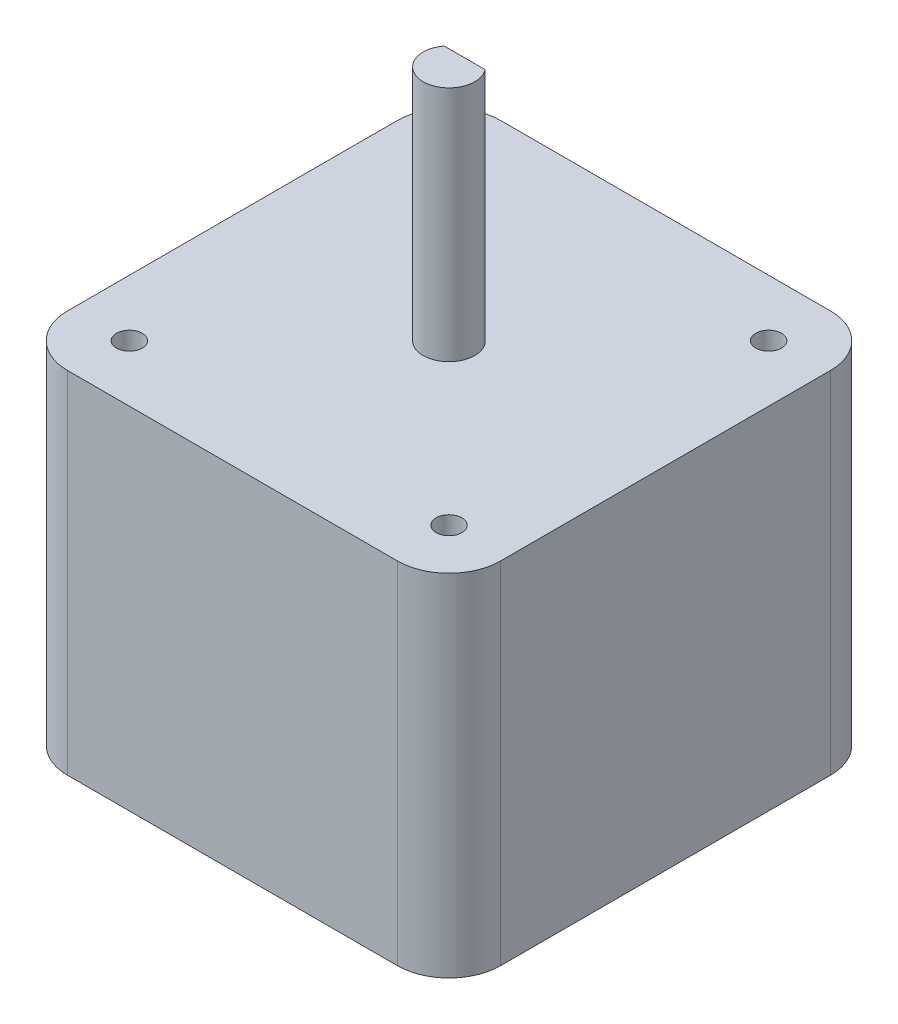
ISO-10303-21;
HEADER;
FILE_DESCRIPTION(('STEP AP214'),'2;1');
FILE_NAME('part.step','',(''),(''),'','','');
FILE_SCHEMA(('AUTOMOTIVE_DESIGN { 1 0 10303 214 1 1 1 1 }'));
ENDSEC;
DATA;
#1=APPLICATION_CONTEXT('core data for automotive mechanical design processes');
#2=APPLICATION_PROTOCOL_DEFINITION('international standard','automotive_design',2000,#1);
#3=PRODUCT_CONTEXT('',#1,'mechanical');
#4=PRODUCT('Part','Part','',(#3));
#5=PRODUCT_RELATED_PRODUCT_CATEGORY('part','',(#4));
#6=PRODUCT_DEFINITION_FORMATION('','',#4);
#7=PRODUCT_DEFINITION_CONTEXT('part definition',#1,'design');
#8=PRODUCT_DEFINITION('design','',#6,#7);
#9=PRODUCT_DEFINITION_SHAPE('','',#8);
#10=(LENGTH_UNIT() NAMED_UNIT(*) SI_UNIT(.MILLI.,.METRE.));
#11=(NAMED_UNIT(*) PLANE_ANGLE_UNIT() SI_UNIT($,.RADIAN.));
#12=(NAMED_UNIT(*) SI_UNIT($,.STERADIAN.) SOLID_ANGLE_UNIT());
#13=UNCERTAINTY_MEASURE_WITH_UNIT(LENGTH_MEASURE(1.E-05),#10,'distance_accuracy_value','');
#14=(GEOMETRIC_REPRESENTATION_CONTEXT(3) GLOBAL_UNCERTAINTY_ASSIGNED_CONTEXT((#13)) GLOBAL_UNIT_ASSIGNED_CONTEXT((#10,
#11,#12)) REPRESENTATION_CONTEXT('',''));
#15=CARTESIAN_POINT('',(0.,0.,0.));
#16=DIRECTION('',(0.,0.,1.));
#17=DIRECTION('',(1.,0.,0.));
#18=AXIS2_PLACEMENT_3D('',#15,#16,#17);
#19=CARTESIAN_POINT('',(0.,34.,0.));
#20=DIRECTION('',(0.,-1.,0.));
#21=DIRECTION('',(0.,0.,-1.));
#22=AXIS2_PLACEMENT_3D('',#19,#20,#21);
#23=PLANE('',#22);
#24=CARTESIAN_POINT('',(-15.5,34.,-15.5));
#25=DIRECTION('',(0.,1.,0.));
#26=DIRECTION('',(0.,0.,1.));
#27=AXIS2_PLACEMENT_3D('',#24,#25,#26);
#28=CIRCLE('',#27,1.25);
#29=CARTESIAN_POINT('',(-15.5,34.,-14.25));
#30=VERTEX_POINT('',#29);
#31=EDGE_CURVE('E140',#30,#30,#28,.T.);
#32=ORIENTED_EDGE('',*,*,#31,.F.);
#33=EDGE_LOOP('',(#32));
#34=FACE_BOUND('',#33,.T.);
#35=CARTESIAN_POINT('',(15.5,34.,15.5));
#36=DIRECTION('',(0.,1.,0.));
#37=DIRECTION('',(0.,0.,1.));
#38=AXIS2_PLACEMENT_3D('',#35,#36,#37);
#39=CIRCLE('',#38,1.25);
#40=CARTESIAN_POINT('',(15.5,34.,16.75));
#41=VERTEX_POINT('',#40);
#42=EDGE_CURVE('E160',#41,#41,#39,.T.);
#43=ORIENTED_EDGE('',*,*,#42,.F.);
#44=EDGE_LOOP('',(#43));
#45=FACE_BOUND('',#44,.T.);
#46=CARTESIAN_POINT('',(-15.5,34.,15.5));
#47=DIRECTION('',(0.,1.,0.));
#48=DIRECTION('',(0.,0.,1.));
#49=AXIS2_PLACEMENT_3D('',#46,#47,#48);
#50=CIRCLE('',#49,1.25);
#51=CARTESIAN_POINT('',(-15.5,34.,16.75));
#52=VERTEX_POINT('',#51);
#53=EDGE_CURVE('E166',#52,#52,#50,.T.);
#54=ORIENTED_EDGE('',*,*,#53,.F.);
#55=EDGE_LOOP('',(#54));
#56=FACE_BOUND('',#55,.T.);
#57=CARTESIAN_POINT('',(15.5,34.,-15.5));
#58=DIRECTION('',(0.,1.,0.));
#59=DIRECTION('',(0.,0.,1.));
#60=AXIS2_PLACEMENT_3D('',#57,#58,#59);
#61=CIRCLE('',#60,1.25);
#62=CARTESIAN_POINT('',(15.5,34.,-14.25));
#63=VERTEX_POINT('',#62);
#64=EDGE_CURVE('E172',#63,#63,#61,.T.);
#65=ORIENTED_EDGE('',*,*,#64,.F.);
#66=EDGE_LOOP('',(#65));
#67=FACE_BOUND('',#66,.T.);
#68=DIRECTION('',(-1.,0.,0.));
#69=VECTOR('',#68,1.);
#70=CARTESIAN_POINT('',(-21.,34.,-21.));
#71=LINE('',#70,#69);
#72=CARTESIAN_POINT('',(16.,34.,-21.));
#73=VERTEX_POINT('',#72);
#74=CARTESIAN_POINT('',(-16.,34.,-21.));
#75=VERTEX_POINT('',#74);
#76=EDGE_CURVE('E182',#73,#75,#71,.T.);
#77=ORIENTED_EDGE('',*,*,#76,.T.);
#78=CARTESIAN_POINT('',(-16.,34.,-16.));
#79=DIRECTION('',(0.,-1.,0.));
#80=DIRECTION('',(0.,0.,-1.));
#81=AXIS2_PLACEMENT_3D('',#78,#79,#80);
#82=CIRCLE('',#81,5.);
#83=CARTESIAN_POINT('',(-21.,34.,-16.));
#84=VERTEX_POINT('',#83);
#85=EDGE_CURVE('E222',#75,#84,#82,.F.);
#86=ORIENTED_EDGE('',*,*,#85,.T.);
#87=DIRECTION('',(0.,0.,1.));
#88=VECTOR('',#87,1.);
#89=CARTESIAN_POINT('',(-21.,34.,21.));
#90=LINE('',#89,#88);
#91=CARTESIAN_POINT('',(-21.,34.,16.));
#92=VERTEX_POINT('',#91);
#93=EDGE_CURVE('E186',#84,#92,#90,.T.);
#94=ORIENTED_EDGE('',*,*,#93,.T.);
#95=CARTESIAN_POINT('',(-16.,34.,16.));
#96=DIRECTION('',(0.,-1.,0.));
#97=DIRECTION('',(0.,0.,-1.));
#98=AXIS2_PLACEMENT_3D('',#95,#96,#97);
#99=CIRCLE('',#98,5.);
#100=CARTESIAN_POINT('',(-16.,34.,21.));
#101=VERTEX_POINT('',#100);
#102=EDGE_CURVE('E61',#92,#101,#99,.F.);
#103=ORIENTED_EDGE('',*,*,#102,.T.);
#104=DIRECTION('',(1.,0.,0.));
#105=VECTOR('',#104,1.);
#106=CARTESIAN_POINT('',(-21.,34.,21.));
#107=LINE('',#106,#105);
#108=CARTESIAN_POINT('',(16.,34.,21.));
#109=VERTEX_POINT('',#108);
#110=EDGE_CURVE('E188',#101,#109,#107,.T.);
#111=ORIENTED_EDGE('',*,*,#110,.T.);
#112=CARTESIAN_POINT('',(16.,34.,16.));
#113=DIRECTION('',(0.,-1.,0.));
#114=DIRECTION('',(0.,0.,-1.));
#115=AXIS2_PLACEMENT_3D('',#112,#113,#114);
#116=CIRCLE('',#115,5.);
#117=CARTESIAN_POINT('',(21.,34.,16.));
#118=VERTEX_POINT('',#117);
#119=EDGE_CURVE('E219',#109,#118,#116,.F.);
#120=ORIENTED_EDGE('',*,*,#119,.T.);
#121=DIRECTION('',(0.,0.,-1.));
#122=VECTOR('',#121,1.);
#123=CARTESIAN_POINT('',(21.,34.,21.));
#124=LINE('',#123,#122);
#125=CARTESIAN_POINT('',(21.,34.,-16.));
#126=VERTEX_POINT('',#125);
#127=EDGE_CURVE('E179',#118,#126,#124,.T.);
#128=ORIENTED_EDGE('',*,*,#127,.T.);
#129=CARTESIAN_POINT('',(16.,34.,-16.));
#130=DIRECTION('',(0.,-1.,0.));
#131=DIRECTION('',(0.,0.,-1.));
#132=AXIS2_PLACEMENT_3D('',#129,#130,#131);
#133=CIRCLE('',#132,5.);
#134=EDGE_CURVE('E217',#126,#73,#133,.F.);
#135=ORIENTED_EDGE('',*,*,#134,.T.);
#136=EDGE_LOOP('',(#77,#86,#94,#103,#111,#120,#128,#135));
#137=FACE_BOUND('',#136,.T.);
#138=CARTESIAN_POINT('',(0.,34.,0.));
#139=DIRECTION('',(0.,1.,0.));
#140=DIRECTION('',(0.,0.,1.));
#141=AXIS2_PLACEMENT_3D('',#138,#139,#140);
#142=CIRCLE('',#141,2.5);
#143=CARTESIAN_POINT('',(-1.98456792227328,34.,-1.52035856359081));
#144=VERTEX_POINT('',#143);
#145=CARTESIAN_POINT('',(1.98456792227328,34.,-1.52035856359081));
#146=VERTEX_POINT('',#145);
#147=EDGE_CURVE('E149',#144,#146,#142,.T.);
#148=ORIENTED_EDGE('',*,*,#147,.F.);
#149=DIRECTION('',(1.,0.,0.));
#150=VECTOR('',#149,1.);
#151=CARTESIAN_POINT('',(0.,34.,-1.52035856359081));
#152=LINE('',#151,#150);
#153=EDGE_CURVE('E137',#144,#146,#152,.T.);
#154=ORIENTED_EDGE('',*,*,#153,.T.);
#155=EDGE_LOOP('',(#148,#154));
#156=FACE_BOUND('',#155,.T.);
#157=ADVANCED_FACE('F39',(#34,#45,#56,#67,#137,#156),#23,.F.);
#158=CARTESIAN_POINT('',(21.,34.,21.));
#159=DIRECTION('',(-1.,0.,0.));
#160=DIRECTION('',(0.,0.,1.));
#161=AXIS2_PLACEMENT_3D('',#158,#159,#160);
#162=PLANE('',#161);
#163=ORIENTED_EDGE('',*,*,#127,.F.);
#164=DIRECTION('',(0.,-1.,0.));
#165=VECTOR('',#164,1.);
#166=CARTESIAN_POINT('',(21.,34.,16.));
#167=LINE('',#166,#165);
#168=CARTESIAN_POINT('',(21.,0.,16.));
#169=VERTEX_POINT('',#168);
#170=EDGE_CURVE('E11',#118,#169,#167,.T.);
#171=ORIENTED_EDGE('',*,*,#170,.T.);
#172=DIRECTION('',(0.,0.,-1.));
#173=VECTOR('',#172,1.);
#174=CARTESIAN_POINT('',(21.,0.,21.));
#175=LINE('',#174,#173);
#176=CARTESIAN_POINT('',(21.,0.,-16.));
#177=VERTEX_POINT('',#176);
#178=EDGE_CURVE('E178',#169,#177,#175,.T.);
#179=ORIENTED_EDGE('',*,*,#178,.T.);
#180=DIRECTION('',(0.,-1.,0.));
#181=VECTOR('',#180,1.);
#182=CARTESIAN_POINT('',(21.,34.,-16.));
#183=LINE('',#182,#181);
#184=EDGE_CURVE('E47',#177,#126,#183,.F.);
#185=ORIENTED_EDGE('',*,*,#184,.T.);
#186=EDGE_LOOP('',(#163,#171,#179,#185));
#187=FACE_BOUND('',#186,.T.);
#188=ADVANCED_FACE('F230',(#187),#162,.F.);
#189=CARTESIAN_POINT('',(-21.,34.,-21.));
#190=DIRECTION('',(0.,0.,1.));
#191=DIRECTION('',(1.,0.,0.));
#192=AXIS2_PLACEMENT_3D('',#189,#190,#191);
#193=PLANE('',#192);
#194=DIRECTION('',(-1.,0.,0.));
#195=VECTOR('',#194,1.);
#196=CARTESIAN_POINT('',(-21.,0.,-21.));
#197=LINE('',#196,#195);
#198=CARTESIAN_POINT('',(16.,0.,-21.));
#199=VERTEX_POINT('',#198);
#200=CARTESIAN_POINT('',(-16.,0.,-21.));
#201=VERTEX_POINT('',#200);
#202=EDGE_CURVE('E193',#199,#201,#197,.T.);
#203=ORIENTED_EDGE('',*,*,#202,.T.);
#204=DIRECTION('',(0.,-1.,0.));
#205=VECTOR('',#204,1.);
#206=CARTESIAN_POINT('',(-16.,34.,-21.));
#207=LINE('',#206,#205);
#208=EDGE_CURVE('E215',#201,#75,#207,.F.);
#209=ORIENTED_EDGE('',*,*,#208,.T.);
#210=ORIENTED_EDGE('',*,*,#76,.F.);
#211=DIRECTION('',(0.,-1.,0.));
#212=VECTOR('',#211,1.);
#213=CARTESIAN_POINT('',(16.,34.,-21.));
#214=LINE('',#213,#212);
#215=EDGE_CURVE('E212',#73,#199,#214,.T.);
#216=ORIENTED_EDGE('',*,*,#215,.T.);
#217=EDGE_LOOP('',(#203,#209,#210,#216));
#218=FACE_BOUND('',#217,.T.);
#219=ADVANCED_FACE('F241',(#218),#193,.F.);
#220=CARTESIAN_POINT('',(-21.,34.,21.));
#221=DIRECTION('',(1.,0.,0.));
#222=DIRECTION('',(0.,0.,-1.));
#223=AXIS2_PLACEMENT_3D('',#220,#221,#222);
#224=PLANE('',#223);
#225=ORIENTED_EDGE('',*,*,#93,.F.);
#226=DIRECTION('',(0.,-1.,0.));
#227=VECTOR('',#226,1.);
#228=CARTESIAN_POINT('',(-21.,34.,-16.));
#229=LINE('',#228,#227);
#230=CARTESIAN_POINT('',(-21.,0.,-16.));
#231=VERTEX_POINT('',#230);
#232=EDGE_CURVE('E201',#84,#231,#229,.T.);
#233=ORIENTED_EDGE('',*,*,#232,.T.);
#234=DIRECTION('',(0.,0.,1.));
#235=VECTOR('',#234,1.);
#236=CARTESIAN_POINT('',(-21.,0.,21.));
#237=LINE('',#236,#235);
#238=CARTESIAN_POINT('',(-21.,0.,16.));
#239=VERTEX_POINT('',#238);
#240=EDGE_CURVE('E196',#231,#239,#237,.T.);
#241=ORIENTED_EDGE('',*,*,#240,.T.);
#242=DIRECTION('',(0.,-1.,0.));
#243=VECTOR('',#242,1.);
#244=CARTESIAN_POINT('',(-21.,34.,16.));
#245=LINE('',#244,#243);
#246=EDGE_CURVE('E190',#239,#92,#245,.F.);
#247=ORIENTED_EDGE('',*,*,#246,.T.);
#248=EDGE_LOOP('',(#225,#233,#241,#247));
#249=FACE_BOUND('',#248,.T.);
#250=ADVANCED_FACE('F252',(#249),#224,.F.);
#251=CARTESIAN_POINT('',(-21.,34.,21.));
#252=DIRECTION('',(0.,0.,-1.));
#253=DIRECTION('',(-1.,0.,0.));
#254=AXIS2_PLACEMENT_3D('',#251,#252,#253);
#255=PLANE('',#254);
#256=ORIENTED_EDGE('',*,*,#110,.F.);
#257=DIRECTION('',(0.,-1.,0.));
#258=VECTOR('',#257,1.);
#259=CARTESIAN_POINT('',(-16.,34.,21.));
#260=LINE('',#259,#258);
#261=CARTESIAN_POINT('',(-16.,0.,21.));
#262=VERTEX_POINT('',#261);
#263=EDGE_CURVE('E225',#101,#262,#260,.T.);
#264=ORIENTED_EDGE('',*,*,#263,.T.);
#265=DIRECTION('',(1.,0.,0.));
#266=VECTOR('',#265,1.);
#267=CARTESIAN_POINT('',(-21.,0.,21.));
#268=LINE('',#267,#266);
#269=CARTESIAN_POINT('',(16.,0.,21.));
#270=VERTEX_POINT('',#269);
#271=EDGE_CURVE('E183',#262,#270,#268,.T.);
#272=ORIENTED_EDGE('',*,*,#271,.T.);
#273=DIRECTION('',(0.,-1.,0.));
#274=VECTOR('',#273,1.);
#275=CARTESIAN_POINT('',(16.,34.,21.));
#276=LINE('',#275,#274);
#277=EDGE_CURVE('E54',#270,#109,#276,.F.);
#278=ORIENTED_EDGE('',*,*,#277,.T.);
#279=EDGE_LOOP('',(#256,#264,#272,#278));
#280=FACE_BOUND('',#279,.T.);
#281=ADVANCED_FACE('F258',(#280),#255,.F.);
#282=CARTESIAN_POINT('',(0.,0.,0.));
#283=DIRECTION('',(0.,-1.,0.));
#284=DIRECTION('',(0.,0.,-1.));
#285=AXIS2_PLACEMENT_3D('',#282,#283,#284);
#286=PLANE('',#285);
#287=ORIENTED_EDGE('',*,*,#240,.F.);
#288=CARTESIAN_POINT('',(-16.,0.,-16.));
#289=DIRECTION('',(0.,-1.,0.));
#290=DIRECTION('',(0.,0.,-1.));
#291=AXIS2_PLACEMENT_3D('',#288,#289,#290);
#292=CIRCLE('',#291,5.);
#293=EDGE_CURVE('E210',#231,#201,#292,.T.);
#294=ORIENTED_EDGE('',*,*,#293,.T.);
#295=ORIENTED_EDGE('',*,*,#202,.F.);
#296=CARTESIAN_POINT('',(16.,0.,-16.));
#297=DIRECTION('',(0.,-1.,0.));
#298=DIRECTION('',(0.,0.,-1.));
#299=AXIS2_PLACEMENT_3D('',#296,#297,#298);
#300=CIRCLE('',#299,5.);
#301=EDGE_CURVE('E204',#199,#177,#300,.T.);
#302=ORIENTED_EDGE('',*,*,#301,.T.);
#303=ORIENTED_EDGE('',*,*,#178,.F.);
#304=CARTESIAN_POINT('',(16.,0.,16.));
#305=DIRECTION('',(0.,-1.,0.));
#306=DIRECTION('',(0.,0.,-1.));
#307=AXIS2_PLACEMENT_3D('',#304,#305,#306);
#308=CIRCLE('',#307,5.);
#309=EDGE_CURVE('E206',#169,#270,#308,.T.);
#310=ORIENTED_EDGE('',*,*,#309,.T.);
#311=ORIENTED_EDGE('',*,*,#271,.F.);
#312=CARTESIAN_POINT('',(-16.,0.,16.));
#313=DIRECTION('',(0.,-1.,0.));
#314=DIRECTION('',(0.,0.,-1.));
#315=AXIS2_PLACEMENT_3D('',#312,#313,#314);
#316=CIRCLE('',#315,5.);
#317=EDGE_CURVE('E208',#262,#239,#316,.T.);
#318=ORIENTED_EDGE('',*,*,#317,.T.);
#319=EDGE_LOOP('',(#287,#294,#295,#302,#303,#310,#311,#318));
#320=FACE_BOUND('',#319,.T.);
#321=ADVANCED_FACE('F245',(#320),#286,.T.);
#322=CARTESIAN_POINT('',(15.5,29.,-15.5));
#323=DIRECTION('',(0.,1.,0.));
#324=DIRECTION('',(0.,0.,1.));
#325=AXIS2_PLACEMENT_3D('',#322,#323,#324);
#326=CONICAL_SURFACE('',#325,1.25,1.02974425867665);
#327=CARTESIAN_POINT('',(15.5,28.2489242262155,-15.5));
#328=VERTEX_POINT('',#327);
#329=VERTEX_LOOP('',#328);
#330=FACE_BOUND('',#329,.T.);
#331=CARTESIAN_POINT('',(15.5,29.,-15.5));
#332=DIRECTION('',(0.,1.,0.));
#333=DIRECTION('',(0.,0.,1.));
#334=AXIS2_PLACEMENT_3D('',#331,#332,#333);
#335=CIRCLE('',#334,1.25);
#336=CARTESIAN_POINT('',(15.5,29.,-14.25));
#337=VERTEX_POINT('',#336);
#338=EDGE_CURVE('E175',#337,#337,#335,.T.);
#339=ORIENTED_EDGE('',*,*,#338,.T.);
#340=EDGE_LOOP('',(#339));
#341=FACE_BOUND('',#340,.T.);
#342=ADVANCED_FACE('F278',(#330,#341),#326,.F.);
#343=CARTESIAN_POINT('',(15.5,34.,-15.5));
#344=DIRECTION('',(0.,1.,0.));
#345=DIRECTION('',(0.,0.,1.));
#346=AXIS2_PLACEMENT_3D('',#343,#344,#345);
#347=CYLINDRICAL_SURFACE('',#346,1.25);
#348=ORIENTED_EDGE('',*,*,#338,.F.);
#349=EDGE_LOOP('',(#348));
#350=FACE_BOUND('',#349,.T.);
#351=ORIENTED_EDGE('',*,*,#64,.T.);
#352=EDGE_LOOP('',(#351));
#353=FACE_BOUND('',#352,.T.);
#354=ADVANCED_FACE('F322',(#350,#353),#347,.F.);
#355=CARTESIAN_POINT('',(-15.5,29.,15.5));
#356=DIRECTION('',(0.,1.,0.));
#357=DIRECTION('',(0.,0.,1.));
#358=AXIS2_PLACEMENT_3D('',#355,#356,#357);
#359=CONICAL_SURFACE('',#358,1.25,1.02974425867665);
#360=CARTESIAN_POINT('',(-15.5,28.2489242262155,15.5));
#361=VERTEX_POINT('',#360);
#362=VERTEX_LOOP('',#361);
#363=FACE_BOUND('',#362,.T.);
#364=CARTESIAN_POINT('',(-15.5,29.,15.5));
#365=DIRECTION('',(0.,1.,0.));
#366=DIRECTION('',(0.,0.,1.));
#367=AXIS2_PLACEMENT_3D('',#364,#365,#366);
#368=CIRCLE('',#367,1.25);
#369=CARTESIAN_POINT('',(-15.5,29.,16.75));
#370=VERTEX_POINT('',#369);
#371=EDGE_CURVE('E169',#370,#370,#368,.T.);
#372=ORIENTED_EDGE('',*,*,#371,.T.);
#373=EDGE_LOOP('',(#372));
#374=FACE_BOUND('',#373,.T.);
#375=ADVANCED_FACE('F319',(#363,#374),#359,.F.);
#376=CARTESIAN_POINT('',(-15.5,34.,15.5));
#377=DIRECTION('',(0.,1.,0.));
#378=DIRECTION('',(0.,0.,1.));
#379=AXIS2_PLACEMENT_3D('',#376,#377,#378);
#380=CYLINDRICAL_SURFACE('',#379,1.25);
#381=ORIENTED_EDGE('',*,*,#371,.F.);
#382=EDGE_LOOP('',(#381));
#383=FACE_BOUND('',#382,.T.);
#384=ORIENTED_EDGE('',*,*,#53,.T.);
#385=EDGE_LOOP('',(#384));
#386=FACE_BOUND('',#385,.T.);
#387=ADVANCED_FACE('F315',(#383,#386),#380,.F.);
#388=CARTESIAN_POINT('',(15.5,29.,15.5));
#389=DIRECTION('',(0.,1.,0.));
#390=DIRECTION('',(0.,0.,1.));
#391=AXIS2_PLACEMENT_3D('',#388,#389,#390);
#392=CONICAL_SURFACE('',#391,1.25,1.02974425867665);
#393=CARTESIAN_POINT('',(15.5,28.2489242262155,15.5));
#394=VERTEX_POINT('',#393);
#395=VERTEX_LOOP('',#394);
#396=FACE_BOUND('',#395,.T.);
#397=CARTESIAN_POINT('',(15.5,29.,15.5));
#398=DIRECTION('',(0.,1.,0.));
#399=DIRECTION('',(0.,0.,1.));
#400=AXIS2_PLACEMENT_3D('',#397,#398,#399);
#401=CIRCLE('',#400,1.25);
#402=CARTESIAN_POINT('',(15.5,29.,16.75));
#403=VERTEX_POINT('',#402);
#404=EDGE_CURVE('E163',#403,#403,#401,.T.);
#405=ORIENTED_EDGE('',*,*,#404,.T.);
#406=EDGE_LOOP('',(#405));
#407=FACE_BOUND('',#406,.T.);
#408=ADVANCED_FACE('F311',(#396,#407),#392,.F.);
#409=CARTESIAN_POINT('',(15.5,34.,15.5));
#410=DIRECTION('',(0.,1.,0.));
#411=DIRECTION('',(0.,0.,1.));
#412=AXIS2_PLACEMENT_3D('',#409,#410,#411);
#413=CYLINDRICAL_SURFACE('',#412,1.25);
#414=ORIENTED_EDGE('',*,*,#404,.F.);
#415=EDGE_LOOP('',(#414));
#416=FACE_BOUND('',#415,.T.);
#417=ORIENTED_EDGE('',*,*,#42,.T.);
#418=EDGE_LOOP('',(#417));
#419=FACE_BOUND('',#418,.T.);
#420=ADVANCED_FACE('F307',(#416,#419),#413,.F.);
#421=CARTESIAN_POINT('',(-15.5,29.,-15.5));
#422=DIRECTION('',(0.,1.,0.));
#423=DIRECTION('',(0.,0.,1.));
#424=AXIS2_PLACEMENT_3D('',#421,#422,#423);
#425=CONICAL_SURFACE('',#424,1.25,1.02974425867665);
#426=CARTESIAN_POINT('',(-15.5,28.2489242262155,-15.5));
#427=VERTEX_POINT('',#426);
#428=VERTEX_LOOP('',#427);
#429=FACE_BOUND('',#428,.T.);
#430=CARTESIAN_POINT('',(-15.5,29.,-15.5));
#431=DIRECTION('',(0.,1.,0.));
#432=DIRECTION('',(0.,0.,1.));
#433=AXIS2_PLACEMENT_3D('',#430,#431,#432);
#434=CIRCLE('',#433,1.25);
#435=CARTESIAN_POINT('',(-15.5,29.,-14.25));
#436=VERTEX_POINT('',#435);
#437=EDGE_CURVE('E157',#436,#436,#434,.T.);
#438=ORIENTED_EDGE('',*,*,#437,.T.);
#439=EDGE_LOOP('',(#438));
#440=FACE_BOUND('',#439,.T.);
#441=ADVANCED_FACE('F303',(#429,#440),#425,.F.);
#442=CARTESIAN_POINT('',(-15.5,34.,-15.5));
#443=DIRECTION('',(0.,1.,0.));
#444=DIRECTION('',(0.,0.,1.));
#445=AXIS2_PLACEMENT_3D('',#442,#443,#444);
#446=CYLINDRICAL_SURFACE('',#445,1.25);
#447=ORIENTED_EDGE('',*,*,#437,.F.);
#448=EDGE_LOOP('',(#447));
#449=FACE_BOUND('',#448,.T.);
#450=ORIENTED_EDGE('',*,*,#31,.T.);
#451=EDGE_LOOP('',(#450));
#452=FACE_BOUND('',#451,.T.);
#453=ADVANCED_FACE('F300',(#449,#452),#446,.F.);
#454=CARTESIAN_POINT('',(0.,57.,-1.52035856359081));
#455=DIRECTION('',(0.,0.,-1.));
#456=DIRECTION('',(-1.,0.,0.));
#457=AXIS2_PLACEMENT_3D('',#454,#455,#456);
#458=PLANE('',#457);
#459=ORIENTED_EDGE('',*,*,#153,.F.);
#460=DIRECTION('',(0.,-1.,0.));
#461=VECTOR('',#460,1.);
#462=CARTESIAN_POINT('',(-1.98456792227328,57.,-1.52035856359081));
#463=LINE('',#462,#461);
#464=CARTESIAN_POINT('',(-1.98456792227328,57.,-1.52035856359081));
#465=VERTEX_POINT('',#464);
#466=EDGE_CURVE('E131',#465,#144,#463,.T.);
#467=ORIENTED_EDGE('',*,*,#466,.F.);
#468=DIRECTION('',(1.,0.,0.));
#469=VECTOR('',#468,1.);
#470=CARTESIAN_POINT('',(0.,57.,-1.52035856359081));
#471=LINE('',#470,#469);
#472=CARTESIAN_POINT('',(1.98456792227328,57.,-1.52035856359081));
#473=VERTEX_POINT('',#472);
#474=EDGE_CURVE('E136',#465,#473,#471,.T.);
#475=ORIENTED_EDGE('',*,*,#474,.T.);
#476=DIRECTION('',(0.,-1.,0.));
#477=VECTOR('',#476,1.);
#478=CARTESIAN_POINT('',(1.98456792227328,57.,-1.52035856359081));
#479=LINE('',#478,#477);
#480=EDGE_CURVE('E141',#473,#146,#479,.T.);
#481=ORIENTED_EDGE('',*,*,#480,.T.);
#482=EDGE_LOOP('',(#459,#467,#475,#481));
#483=FACE_BOUND('',#482,.T.);
#484=ADVANCED_FACE('F133',(#483),#458,.T.);
#485=CARTESIAN_POINT('',(0.,57.,0.));
#486=DIRECTION('',(0.,-1.,0.));
#487=DIRECTION('',(0.,0.,-1.));
#488=AXIS2_PLACEMENT_3D('',#485,#486,#487);
#489=CYLINDRICAL_SURFACE('',#488,2.5);
#490=ORIENTED_EDGE('',*,*,#147,.T.);
#491=ORIENTED_EDGE('',*,*,#480,.F.);
#492=CARTESIAN_POINT('',(0.,57.,0.));
#493=DIRECTION('',(0.,1.,0.));
#494=DIRECTION('',(0.,0.,1.));
#495=AXIS2_PLACEMENT_3D('',#492,#493,#494);
#496=CIRCLE('',#495,2.5);
#497=EDGE_CURVE('E144',#465,#473,#496,.T.);
#498=ORIENTED_EDGE('',*,*,#497,.F.);
#499=ORIENTED_EDGE('',*,*,#466,.T.);
#500=EDGE_LOOP('',(#490,#491,#498,#499));
#501=FACE_BOUND('',#500,.T.);
#502=ADVANCED_FACE('F145',(#501),#489,.T.);
#503=CARTESIAN_POINT('',(0.,57.,0.));
#504=DIRECTION('',(0.,1.,0.));
#505=DIRECTION('',(0.,0.,1.));
#506=AXIS2_PLACEMENT_3D('',#503,#504,#505);
#507=PLANE('',#506);
#508=ORIENTED_EDGE('',*,*,#474,.F.);
#509=ORIENTED_EDGE('',*,*,#497,.T.);
#510=EDGE_LOOP('',(#508,#509));
#511=FACE_BOUND('',#510,.T.);
#512=ADVANCED_FACE('F148',(#511),#507,.T.);
#513=CARTESIAN_POINT('',(-16.,34.,-16.));
#514=DIRECTION('',(0.,-1.,0.));
#515=DIRECTION('',(0.,0.,-1.));
#516=AXIS2_PLACEMENT_3D('',#513,#514,#515);
#517=CYLINDRICAL_SURFACE('',#516,5.);
#518=ORIENTED_EDGE('',*,*,#85,.F.);
#519=ORIENTED_EDGE('',*,*,#208,.F.);
#520=ORIENTED_EDGE('',*,*,#293,.F.);
#521=ORIENTED_EDGE('',*,*,#232,.F.);
#522=EDGE_LOOP('',(#518,#519,#520,#521));
#523=FACE_BOUND('',#522,.T.);
#524=ADVANCED_FACE('F249',(#523),#517,.T.);
#525=CARTESIAN_POINT('',(-16.,34.,16.));
#526=DIRECTION('',(0.,-1.,0.));
#527=DIRECTION('',(0.,0.,-1.));
#528=AXIS2_PLACEMENT_3D('',#525,#526,#527);
#529=CYLINDRICAL_SURFACE('',#528,5.);
#530=ORIENTED_EDGE('',*,*,#102,.F.);
#531=ORIENTED_EDGE('',*,*,#246,.F.);
#532=ORIENTED_EDGE('',*,*,#317,.F.);
#533=ORIENTED_EDGE('',*,*,#263,.F.);
#534=EDGE_LOOP('',(#530,#531,#532,#533));
#535=FACE_BOUND('',#534,.T.);
#536=ADVANCED_FACE('F256',(#535),#529,.T.);
#537=CARTESIAN_POINT('',(16.,34.,16.));
#538=DIRECTION('',(0.,-1.,0.));
#539=DIRECTION('',(0.,0.,-1.));
#540=AXIS2_PLACEMENT_3D('',#537,#538,#539);
#541=CYLINDRICAL_SURFACE('',#540,5.);
#542=ORIENTED_EDGE('',*,*,#119,.F.);
#543=ORIENTED_EDGE('',*,*,#277,.F.);
#544=ORIENTED_EDGE('',*,*,#309,.F.);
#545=ORIENTED_EDGE('',*,*,#170,.F.);
#546=EDGE_LOOP('',(#542,#543,#544,#545));
#547=FACE_BOUND('',#546,.T.);
#548=ADVANCED_FACE('F260',(#547),#541,.T.);
#549=CARTESIAN_POINT('',(16.,34.,-16.));
#550=DIRECTION('',(0.,-1.,0.));
#551=DIRECTION('',(0.,0.,-1.));
#552=AXIS2_PLACEMENT_3D('',#549,#550,#551);
#553=CYLINDRICAL_SURFACE('',#552,5.);
#554=ORIENTED_EDGE('',*,*,#134,.F.);
#555=ORIENTED_EDGE('',*,*,#184,.F.);
#556=ORIENTED_EDGE('',*,*,#301,.F.);
#557=ORIENTED_EDGE('',*,*,#215,.F.);
#558=EDGE_LOOP('',(#554,#555,#556,#557));
#559=FACE_BOUND('',#558,.T.);
#560=ADVANCED_FACE('F41',(#559),#553,.T.);
#561=CLOSED_SHELL('',(#157,#188,#219,#250,#281,#321,#342,#354,#375,#387,#408,#420,#441,#453,
#484,#502,#512,#524,#536,#548,#560));
#562=MANIFOLD_SOLID_BREP('B2',#561);
#563=ADVANCED_BREP_SHAPE_REPRESENTATION('',(#18,#562),#14);
#564=SHAPE_DEFINITION_REPRESENTATION(#9,#563);
ENDSEC;
END-ISO-10303-21;
